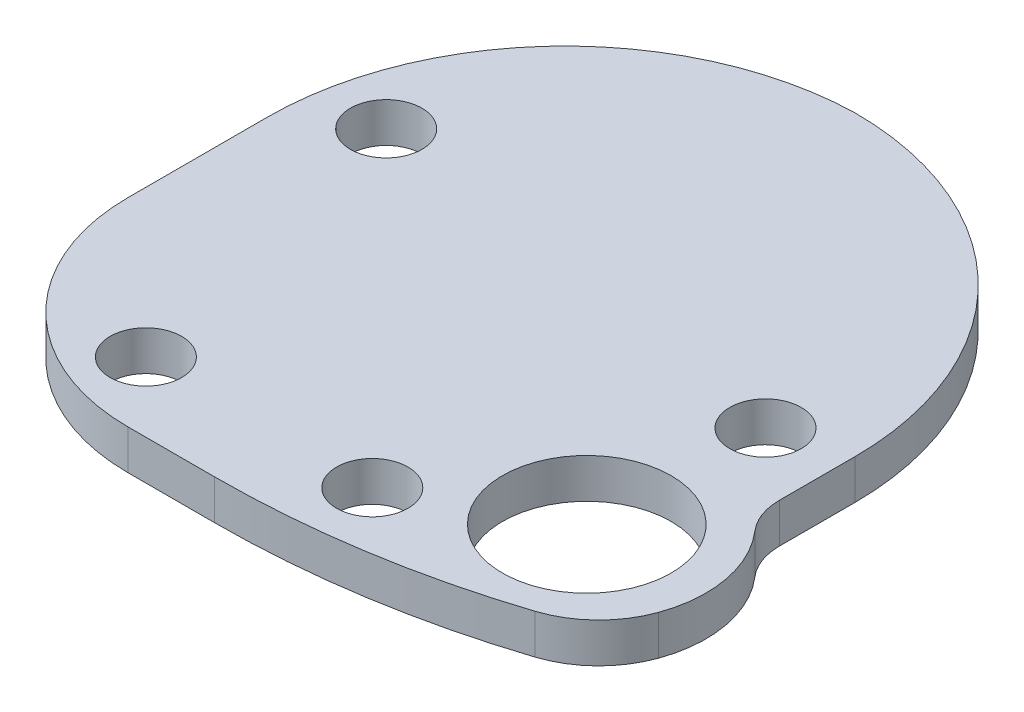
ISO-10303-21;
HEADER;
FILE_DESCRIPTION(('STEP AP214'),'2;1');
FILE_NAME('part.step','',(''),(''),'','','');
FILE_SCHEMA(('AUTOMOTIVE_DESIGN { 1 0 10303 214 1 1 1 1 }'));
ENDSEC;
DATA;
#1=APPLICATION_CONTEXT('core data for automotive mechanical design processes');
#2=APPLICATION_PROTOCOL_DEFINITION('international standard','automotive_design',2000,#1);
#3=PRODUCT_CONTEXT('',#1,'mechanical');
#4=PRODUCT('Part','Part','',(#3));
#5=PRODUCT_RELATED_PRODUCT_CATEGORY('part','',(#4));
#6=PRODUCT_DEFINITION_FORMATION('','',#4);
#7=PRODUCT_DEFINITION_CONTEXT('part definition',#1,'design');
#8=PRODUCT_DEFINITION('design','',#6,#7);
#9=PRODUCT_DEFINITION_SHAPE('','',#8);
#10=(LENGTH_UNIT() NAMED_UNIT(*) SI_UNIT(.MILLI.,.METRE.));
#11=(NAMED_UNIT(*) PLANE_ANGLE_UNIT() SI_UNIT($,.RADIAN.));
#12=(NAMED_UNIT(*) SI_UNIT($,.STERADIAN.) SOLID_ANGLE_UNIT());
#13=UNCERTAINTY_MEASURE_WITH_UNIT(LENGTH_MEASURE(1.E-05),#10,'distance_accuracy_value','');
#14=(GEOMETRIC_REPRESENTATION_CONTEXT(3) GLOBAL_UNCERTAINTY_ASSIGNED_CONTEXT((#13)) GLOBAL_UNIT_ASSIGNED_CONTEXT((#10,
#11,#12)) REPRESENTATION_CONTEXT('',''));
#15=CARTESIAN_POINT('',(0.,0.,0.));
#16=DIRECTION('',(0.,0.,1.));
#17=DIRECTION('',(1.,0.,0.));
#18=AXIS2_PLACEMENT_3D('',#15,#16,#17);
#19=CARTESIAN_POINT('',(48.3999999999403,3.,0.));
#20=DIRECTION('',(1.,0.,0.));
#21=DIRECTION('',(0.,0.,1.));
#22=AXIS2_PLACEMENT_3D('',#19,#20,#21);
#23=PLANE('',#22);
#24=DIRECTION('',(0.,0.,1.));
#25=VECTOR('',#24,1.);
#26=CARTESIAN_POINT('',(48.3999999999403,-14.8,100.3));
#27=LINE('',#26,#25);
#28=CARTESIAN_POINT('',(48.3999999999403,-14.8,100.3));
#29=VERTEX_POINT('',#28);
#30=CARTESIAN_POINT('',(48.3999999999403,-14.8,104.104238810875));
#31=VERTEX_POINT('',#30);
#32=EDGE_CURVE('E160',#29,#31,#27,.T.);
#33=ORIENTED_EDGE('',*,*,#32,.T.);
#34=DIRECTION('',(0.,-1.,0.));
#35=VECTOR('',#34,1.);
#36=CARTESIAN_POINT('',(48.3999999999403,3.,104.104238810875));
#37=LINE('',#36,#35);
#38=CARTESIAN_POINT('',(48.3999999999403,-16.8,104.104238810875));
#39=VERTEX_POINT('',#38);
#40=EDGE_CURVE('E43',#31,#39,#37,.T.);
#41=ORIENTED_EDGE('',*,*,#40,.T.);
#42=DIRECTION('',(0.,0.,1.));
#43=VECTOR('',#42,1.);
#44=CARTESIAN_POINT('',(48.3999999999403,-16.8,100.3));
#45=LINE('',#44,#43);
#46=CARTESIAN_POINT('',(48.3999999999403,-16.8,100.3));
#47=VERTEX_POINT('',#46);
#48=EDGE_CURVE('E157',#47,#39,#45,.T.);
#49=ORIENTED_EDGE('',*,*,#48,.F.);
#50=DIRECTION('',(0.,-1.,0.));
#51=VECTOR('',#50,1.);
#52=CARTESIAN_POINT('',(48.3999999999403,3.,100.3));
#53=LINE('',#52,#51);
#54=EDGE_CURVE('E149',#29,#47,#53,.T.);
#55=ORIENTED_EDGE('',*,*,#54,.F.);
#56=EDGE_LOOP('',(#33,#41,#49,#55));
#57=FACE_BOUND('',#56,.T.);
#58=ADVANCED_FACE('F35',(#57),#23,.T.);
#59=CARTESIAN_POINT('',(44.5999999998807,3.,110.));
#60=DIRECTION('',(0.,-1.,0.));
#61=DIRECTION('',(0.,0.,-1.));
#62=AXIS2_PLACEMENT_3D('',#59,#60,#61);
#63=CYLINDRICAL_SURFACE('',#62,6.);
#64=DIRECTION('',(0.,-1.,0.));
#65=VECTOR('',#64,1.);
#66=CARTESIAN_POINT('',(49.1333333332538,3.,106.069492540583));
#67=LINE('',#66,#65);
#68=CARTESIAN_POINT('',(49.1333333332538,-16.8,106.069492540583));
#69=VERTEX_POINT('',#68);
#70=CARTESIAN_POINT('',(49.1333333332538,-14.8,106.069492540583));
#71=VERTEX_POINT('',#70);
#72=EDGE_CURVE('E11',#69,#71,#67,.F.);
#73=ORIENTED_EDGE('',*,*,#72,.T.);
#74=CARTESIAN_POINT('',(44.5999999998807,-14.8,110.));
#75=DIRECTION('',(0.,-1.,0.));
#76=DIRECTION('',(0.,0.,-1.));
#77=AXIS2_PLACEMENT_3D('',#74,#75,#76);
#78=CIRCLE('',#77,6.);
#79=CARTESIAN_POINT('',(50.2472360342484,-14.8,112.026999055781));
#80=VERTEX_POINT('',#79);
#81=EDGE_CURVE('E50',#71,#80,#78,.T.);
#82=ORIENTED_EDGE('',*,*,#81,.T.);
#83=DIRECTION('',(0.,-1.,0.));
#84=VECTOR('',#83,1.);
#85=CARTESIAN_POINT('',(50.2472360342484,3.,112.026999055781));
#86=LINE('',#85,#84);
#87=CARTESIAN_POINT('',(50.2472360342484,-16.8,112.026999055781));
#88=VERTEX_POINT('',#87);
#89=EDGE_CURVE('E146',#88,#80,#86,.F.);
#90=ORIENTED_EDGE('',*,*,#89,.F.);
#91=CARTESIAN_POINT('',(44.5999999998807,-16.8,110.));
#92=DIRECTION('',(0.,-1.,0.));
#93=DIRECTION('',(0.,0.,-1.));
#94=AXIS2_PLACEMENT_3D('',#91,#92,#93);
#95=CIRCLE('',#94,6.);
#96=EDGE_CURVE('E168',#69,#88,#95,.T.);
#97=ORIENTED_EDGE('',*,*,#96,.F.);
#98=EDGE_LOOP('',(#73,#82,#90,#97));
#99=FACE_BOUND('',#98,.T.);
#100=ADVANCED_FACE('F247',(#99),#63,.T.);
#101=CARTESIAN_POINT('',(37.5999999998806,3.,117.3));
#102=DIRECTION('',(0.,0.,-1.));
#103=DIRECTION('',(1.,0.,0.));
#104=AXIS2_PLACEMENT_3D('',#101,#102,#103);
#105=PLANE('',#104);
#106=DIRECTION('',(0.,-1.,0.));
#107=VECTOR('',#106,1.);
#108=CARTESIAN_POINT('',(33.1669081557272,3.,117.3));
#109=LINE('',#108,#107);
#110=CARTESIAN_POINT('',(33.1669081557272,-14.8,117.3));
#111=VERTEX_POINT('',#110);
#112=CARTESIAN_POINT('',(33.1669081557272,-16.8,117.3));
#113=VERTEX_POINT('',#112);
#114=EDGE_CURVE('E142',#111,#113,#109,.T.);
#115=ORIENTED_EDGE('',*,*,#114,.F.);
#116=DIRECTION('',(-1.,0.,0.));
#117=VECTOR('',#116,1.);
#118=CARTESIAN_POINT('',(33.1669081557272,-14.8,117.3));
#119=LINE('',#118,#117);
#120=CARTESIAN_POINT('',(28.7999999999403,-14.8,117.3));
#121=VERTEX_POINT('',#120);
#122=EDGE_CURVE('E187',#111,#121,#119,.T.);
#123=ORIENTED_EDGE('',*,*,#122,.T.);
#124=DIRECTION('',(0.,-1.,0.));
#125=VECTOR('',#124,1.);
#126=CARTESIAN_POINT('',(28.7999999999403,3.,117.3));
#127=LINE('',#126,#125);
#128=CARTESIAN_POINT('',(28.7999999999403,-16.8,117.3));
#129=VERTEX_POINT('',#128);
#130=EDGE_CURVE('E117',#129,#121,#127,.F.);
#131=ORIENTED_EDGE('',*,*,#130,.F.);
#132=DIRECTION('',(-1.,0.,0.));
#133=VECTOR('',#132,1.);
#134=CARTESIAN_POINT('',(33.1669081557272,-16.8,117.3));
#135=LINE('',#134,#133);
#136=EDGE_CURVE('E126',#113,#129,#135,.T.);
#137=ORIENTED_EDGE('',*,*,#136,.F.);
#138=EDGE_LOOP('',(#115,#123,#131,#137));
#139=FACE_BOUND('',#138,.T.);
#140=ADVANCED_FACE('F183',(#139),#105,.F.);
#141=CARTESIAN_POINT('',(18.7999999999403,3.,0.));
#142=DIRECTION('',(-1.,0.,0.));
#143=DIRECTION('',(0.,0.,-1.));
#144=AXIS2_PLACEMENT_3D('',#141,#142,#143);
#145=PLANE('',#144);
#146=DIRECTION('',(0.,0.,-1.));
#147=VECTOR('',#146,1.);
#148=CARTESIAN_POINT('',(18.7999999999403,-14.8,107.3));
#149=LINE('',#148,#147);
#150=CARTESIAN_POINT('',(18.7999999999403,-14.8,107.3));
#151=VERTEX_POINT('',#150);
#152=CARTESIAN_POINT('',(18.7999999999403,-14.8,100.294665718181));
#153=VERTEX_POINT('',#152);
#154=EDGE_CURVE('E218',#151,#153,#149,.T.);
#155=ORIENTED_EDGE('',*,*,#154,.T.);
#156=DIRECTION('',(0.,1.,0.));
#157=VECTOR('',#156,1.);
#158=CARTESIAN_POINT('',(18.7999999999403,3.,100.294665718181));
#159=LINE('',#158,#157);
#160=CARTESIAN_POINT('',(18.7999999999403,-16.8,100.294665718181));
#161=VERTEX_POINT('',#160);
#162=EDGE_CURVE('E129',#161,#153,#159,.T.);
#163=ORIENTED_EDGE('',*,*,#162,.F.);
#164=DIRECTION('',(0.,0.,-1.));
#165=VECTOR('',#164,1.);
#166=CARTESIAN_POINT('',(18.7999999999403,-16.8,107.3));
#167=LINE('',#166,#165);
#168=CARTESIAN_POINT('',(18.7999999999403,-16.8,107.3));
#169=VERTEX_POINT('',#168);
#170=EDGE_CURVE('E123',#169,#161,#167,.T.);
#171=ORIENTED_EDGE('',*,*,#170,.F.);
#172=DIRECTION('',(0.,-1.,0.));
#173=VECTOR('',#172,1.);
#174=CARTESIAN_POINT('',(18.7999999999403,-10.5,107.3));
#175=LINE('',#174,#173);
#176=EDGE_CURVE('E108',#151,#169,#175,.T.);
#177=ORIENTED_EDGE('',*,*,#176,.F.);
#178=EDGE_LOOP('',(#155,#163,#171,#177));
#179=FACE_BOUND('',#178,.T.);
#180=ADVANCED_FACE('F128',(#179),#145,.T.);
#181=CARTESIAN_POINT('',(28.7999999999403,3.,107.3));
#182=DIRECTION('',(0.,1.,0.));
#183=DIRECTION('',(0.,0.,1.));
#184=AXIS2_PLACEMENT_3D('',#181,#182,#183);
#185=CYLINDRICAL_SURFACE('',#184,10.);
#186=CARTESIAN_POINT('',(28.7999999999403,-14.8,107.3));
#187=DIRECTION('',(0.,-1.,0.));
#188=DIRECTION('',(0.,0.,-1.));
#189=AXIS2_PLACEMENT_3D('',#186,#187,#188);
#190=CIRCLE('',#189,9.99999999999999);
#191=EDGE_CURVE('E114',#121,#151,#190,.T.);
#192=ORIENTED_EDGE('',*,*,#191,.T.);
#193=ORIENTED_EDGE('',*,*,#176,.T.);
#194=CARTESIAN_POINT('',(28.7999999999403,-16.8,107.3));
#195=DIRECTION('',(0.,-1.,0.));
#196=DIRECTION('',(0.,0.,-1.));
#197=AXIS2_PLACEMENT_3D('',#194,#195,#196);
#198=CIRCLE('',#197,10.);
#199=EDGE_CURVE('E112',#129,#169,#198,.T.);
#200=ORIENTED_EDGE('',*,*,#199,.F.);
#201=ORIENTED_EDGE('',*,*,#130,.T.);
#202=EDGE_LOOP('',(#192,#193,#200,#201));
#203=FACE_BOUND('',#202,.T.);
#204=ADVANCED_FACE('F110',(#203),#185,.T.);
#205=CARTESIAN_POINT('',(33.1669081557272,3.,72.3));
#206=DIRECTION('',(0.,-1.,0.));
#207=DIRECTION('',(0.,0.,-1.));
#208=AXIS2_PLACEMENT_3D('',#205,#206,#207);
#209=CYLINDRICAL_SURFACE('',#208,45.);
#210=CARTESIAN_POINT('',(33.1669081557272,-14.8,72.3));
#211=DIRECTION('',(0.,-1.,0.));
#212=DIRECTION('',(0.,0.,-1.));
#213=AXIS2_PLACEMENT_3D('',#210,#211,#212);
#214=CIRCLE('',#213,45.);
#215=CARTESIAN_POINT('',(47.0879932368438,-14.8,115.092562322959));
#216=VERTEX_POINT('',#215);
#217=EDGE_CURVE('E213',#216,#111,#214,.T.);
#218=ORIENTED_EDGE('',*,*,#217,.T.);
#219=ORIENTED_EDGE('',*,*,#114,.T.);
#220=CARTESIAN_POINT('',(33.1669081557272,-16.8,72.3));
#221=DIRECTION('',(0.,-1.,0.));
#222=DIRECTION('',(0.,0.,-1.));
#223=AXIS2_PLACEMENT_3D('',#220,#221,#222);
#224=CIRCLE('',#223,45.);
#225=CARTESIAN_POINT('',(47.0879932368438,-16.8,115.092562322959));
#226=VERTEX_POINT('',#225);
#227=EDGE_CURVE('E176',#226,#113,#224,.T.);
#228=ORIENTED_EDGE('',*,*,#227,.F.);
#229=DIRECTION('',(0.,-1.,0.));
#230=VECTOR('',#229,1.);
#231=CARTESIAN_POINT('',(47.0879932368438,3.,115.092562322959));
#232=LINE('',#231,#230);
#233=EDGE_CURVE('E144',#216,#226,#232,.T.);
#234=ORIENTED_EDGE('',*,*,#233,.F.);
#235=EDGE_LOOP('',(#218,#219,#228,#234));
#236=FACE_BOUND('',#235,.T.);
#237=ADVANCED_FACE('F258',(#236),#209,.T.);
#238=CARTESIAN_POINT('',(45.5412060056086,3.,110.337833175963));
#239=DIRECTION('',(0.,-1.,0.));
#240=DIRECTION('',(0.,0.,-1.));
#241=AXIS2_PLACEMENT_3D('',#238,#239,#240);
#242=CYLINDRICAL_SURFACE('',#241,5.);
#243=CARTESIAN_POINT('',(45.5412060056086,-14.8,110.337833175963));
#244=DIRECTION('',(0.,-1.,0.));
#245=DIRECTION('',(0.,0.,-1.));
#246=AXIS2_PLACEMENT_3D('',#243,#244,#245);
#247=CIRCLE('',#246,4.99999999999999);
#248=EDGE_CURVE('E210',#80,#216,#247,.T.);
#249=ORIENTED_EDGE('',*,*,#248,.T.);
#250=ORIENTED_EDGE('',*,*,#233,.T.);
#251=CARTESIAN_POINT('',(45.5412060056086,-16.8,110.337833175963));
#252=DIRECTION('',(0.,-1.,0.));
#253=DIRECTION('',(0.,0.,-1.));
#254=AXIS2_PLACEMENT_3D('',#251,#252,#253);
#255=CIRCLE('',#254,4.99999999999999);
#256=EDGE_CURVE('E170',#88,#226,#255,.T.);
#257=ORIENTED_EDGE('',*,*,#256,.F.);
#258=ORIENTED_EDGE('',*,*,#89,.T.);
#259=EDGE_LOOP('',(#249,#250,#257,#258));
#260=FACE_BOUND('',#259,.T.);
#261=ADVANCED_FACE('F261',(#260),#242,.T.);
#262=CARTESIAN_POINT('',(33.3999999999403,3.,100.3));
#263=DIRECTION('',(0.,-1.,0.));
#264=DIRECTION('',(0.,0.,-1.));
#265=AXIS2_PLACEMENT_3D('',#262,#263,#264);
#266=CYLINDRICAL_SURFACE('',#265,15.);
#267=CARTESIAN_POINT('',(33.3999999999403,-14.8,100.3));
#268=DIRECTION('',(0.,-1.,0.));
#269=DIRECTION('',(0.,0.,-1.));
#270=AXIS2_PLACEMENT_3D('',#267,#268,#269);
#271=CIRCLE('',#270,15.);
#272=CARTESIAN_POINT('',(33.3999999999403,-14.8,85.3));
#273=VERTEX_POINT('',#272);
#274=EDGE_CURVE('E135',#273,#29,#271,.T.);
#275=ORIENTED_EDGE('',*,*,#274,.T.);
#276=ORIENTED_EDGE('',*,*,#54,.T.);
#277=CARTESIAN_POINT('',(33.3999999999403,-16.8,100.3));
#278=DIRECTION('',(0.,-1.,0.));
#279=DIRECTION('',(0.,0.,-1.));
#280=AXIS2_PLACEMENT_3D('',#277,#278,#279);
#281=CIRCLE('',#280,15.);
#282=CARTESIAN_POINT('',(33.3999999999403,-16.8,85.3));
#283=VERTEX_POINT('',#282);
#284=EDGE_CURVE('E139',#283,#47,#281,.T.);
#285=ORIENTED_EDGE('',*,*,#284,.F.);
#286=DIRECTION('',(0.,1.,0.));
#287=VECTOR('',#286,1.);
#288=CARTESIAN_POINT('',(33.3999999999403,-16.8,85.3));
#289=LINE('',#288,#287);
#290=EDGE_CURVE('E118',#283,#273,#289,.T.);
#291=ORIENTED_EDGE('',*,*,#290,.T.);
#292=EDGE_LOOP('',(#275,#276,#285,#291));
#293=FACE_BOUND('',#292,.T.);
#294=ADVANCED_FACE('F198',(#293),#266,.T.);
#295=CARTESIAN_POINT('',(44.5999999998807,-9.5,110.));
#296=DIRECTION('',(0.,-1.,0.));
#297=DIRECTION('',(0.,0.,-1.));
#298=AXIS2_PLACEMENT_3D('',#295,#296,#297);
#299=CYLINDRICAL_SURFACE('',#298,4.25);
#300=CARTESIAN_POINT('',(44.5999999998807,-14.8,110.));
#301=DIRECTION('',(0.,-1.,0.));
#302=DIRECTION('',(0.,0.,-1.));
#303=AXIS2_PLACEMENT_3D('',#300,#301,#302);
#304=CIRCLE('',#303,4.25);
#305=CARTESIAN_POINT('',(44.5999999998807,-14.8,105.75));
#306=VERTEX_POINT('',#305);
#307=EDGE_CURVE('E220',#306,#306,#304,.T.);
#308=ORIENTED_EDGE('',*,*,#307,.F.);
#309=EDGE_LOOP('',(#308));
#310=FACE_BOUND('',#309,.T.);
#311=CARTESIAN_POINT('',(44.5999999998807,-16.8,110.));
#312=DIRECTION('',(0.,-1.,0.));
#313=DIRECTION('',(0.,0.,-1.));
#314=AXIS2_PLACEMENT_3D('',#311,#312,#313);
#315=CIRCLE('',#314,4.25);
#316=CARTESIAN_POINT('',(44.5999999998807,-16.8,105.75));
#317=VERTEX_POINT('',#316);
#318=EDGE_CURVE('E136',#317,#317,#315,.T.);
#319=ORIENTED_EDGE('',*,*,#318,.T.);
#320=EDGE_LOOP('',(#319));
#321=FACE_BOUND('',#320,.T.);
#322=ADVANCED_FACE('F227',(#310,#321),#299,.F.);
#323=CARTESIAN_POINT('',(33.7999999999403,3.,100.294665718181));
#324=DIRECTION('',(0.,-1.,0.));
#325=DIRECTION('',(0.,0.,-1.));
#326=AXIS2_PLACEMENT_3D('',#323,#324,#325);
#327=CYLINDRICAL_SURFACE('',#326,15.);
#328=ORIENTED_EDGE('',*,*,#162,.T.);
#329=CARTESIAN_POINT('',(33.7999999999403,-14.8,100.294665718181));
#330=DIRECTION('',(0.,-1.,0.));
#331=DIRECTION('',(0.,0.,-1.));
#332=AXIS2_PLACEMENT_3D('',#329,#330,#331);
#333=CIRCLE('',#332,15.);
#334=EDGE_CURVE('E73',#153,#273,#333,.T.);
#335=ORIENTED_EDGE('',*,*,#334,.T.);
#336=ORIENTED_EDGE('',*,*,#290,.F.);
#337=CARTESIAN_POINT('',(33.7999999999403,-16.8,100.294665718181));
#338=DIRECTION('',(0.,-1.,0.));
#339=DIRECTION('',(0.,0.,-1.));
#340=AXIS2_PLACEMENT_3D('',#337,#338,#339);
#341=CIRCLE('',#340,15.);
#342=EDGE_CURVE('E59',#161,#283,#341,.T.);
#343=ORIENTED_EDGE('',*,*,#342,.F.);
#344=EDGE_LOOP('',(#328,#335,#336,#343));
#345=FACE_BOUND('',#344,.T.);
#346=ADVANCED_FACE('F230',(#345),#327,.T.);
#347=CARTESIAN_POINT('',(51.3999999999403,3.,104.104238810875));
#348=DIRECTION('',(0.,-1.,0.));
#349=DIRECTION('',(0.,0.,-1.));
#350=AXIS2_PLACEMENT_3D('',#347,#348,#349);
#351=CYLINDRICAL_SURFACE('',#350,3.);
#352=ORIENTED_EDGE('',*,*,#40,.F.);
#353=CARTESIAN_POINT('',(51.3999999999403,-14.8,104.104238810875));
#354=DIRECTION('',(0.,1.,0.));
#355=DIRECTION('',(0.,0.,-1.));
#356=AXIS2_PLACEMENT_3D('',#353,#354,#355);
#357=CIRCLE('',#356,3.);
#358=EDGE_CURVE('E200',#31,#71,#357,.T.);
#359=ORIENTED_EDGE('',*,*,#358,.T.);
#360=ORIENTED_EDGE('',*,*,#72,.F.);
#361=CARTESIAN_POINT('',(51.3999999999403,-16.8,104.104238810875));
#362=DIRECTION('',(0.,1.,0.));
#363=DIRECTION('',(0.,0.,-1.));
#364=AXIS2_PLACEMENT_3D('',#361,#362,#363);
#365=CIRCLE('',#364,3.);
#366=EDGE_CURVE('E165',#39,#69,#365,.T.);
#367=ORIENTED_EDGE('',*,*,#366,.F.);
#368=EDGE_LOOP('',(#352,#359,#360,#367));
#369=FACE_BOUND('',#368,.T.);
#370=ADVANCED_FACE('F37',(#369),#351,.F.);
#371=CARTESIAN_POINT('',(33.3999999999403,-16.8,100.3));
#372=DIRECTION('',(0.,-1.,0.));
#373=DIRECTION('',(0.,0.,-1.));
#374=AXIS2_PLACEMENT_3D('',#371,#372,#373);
#375=PLANE('',#374);
#376=CARTESIAN_POINT('',(26.1999999999403,-16.8,113.8));
#377=DIRECTION('',(0.,1.,0.));
#378=DIRECTION('',(0.,0.,1.));
#379=AXIS2_PLACEMENT_3D('',#376,#377,#378);
#380=CIRCLE('',#379,1.8);
#381=CARTESIAN_POINT('',(26.1999999999403,-16.8,115.6));
#382=VERTEX_POINT('',#381);
#383=EDGE_CURVE('E331',#382,#382,#380,.T.);
#384=ORIENTED_EDGE('',*,*,#383,.T.);
#385=EDGE_LOOP('',(#384));
#386=FACE_BOUND('',#385,.T.);
#387=CARTESIAN_POINT('',(22.2999999999403,-16.8,97.8000000000001));
#388=DIRECTION('',(0.,1.,0.));
#389=DIRECTION('',(0.,0.,1.));
#390=AXIS2_PLACEMENT_3D('',#387,#388,#389);
#391=CIRCLE('',#390,1.8);
#392=CARTESIAN_POINT('',(22.2999999999403,-16.8,99.6000000000001));
#393=VERTEX_POINT('',#392);
#394=EDGE_CURVE('E335',#393,#393,#391,.T.);
#395=ORIENTED_EDGE('',*,*,#394,.T.);
#396=EDGE_LOOP('',(#395));
#397=FACE_BOUND('',#396,.T.);
#398=CARTESIAN_POINT('',(44.8999999999403,-16.8,101.3));
#399=DIRECTION('',(0.,1.,0.));
#400=DIRECTION('',(0.,0.,1.));
#401=AXIS2_PLACEMENT_3D('',#398,#399,#400);
#402=CIRCLE('',#401,1.8);
#403=CARTESIAN_POINT('',(44.8999999999403,-16.8,103.1));
#404=VERTEX_POINT('',#403);
#405=EDGE_CURVE('E344',#404,#404,#402,.T.);
#406=ORIENTED_EDGE('',*,*,#405,.T.);
#407=EDGE_LOOP('',(#406));
#408=FACE_BOUND('',#407,.T.);
#409=CARTESIAN_POINT('',(37.5999999998806,-16.8,113.8));
#410=DIRECTION('',(0.,1.,0.));
#411=DIRECTION('',(0.,0.,1.));
#412=AXIS2_PLACEMENT_3D('',#409,#410,#411);
#413=CIRCLE('',#412,1.8);
#414=CARTESIAN_POINT('',(37.5999999998806,-16.8,115.6));
#415=VERTEX_POINT('',#414);
#416=EDGE_CURVE('E201',#415,#415,#413,.T.);
#417=ORIENTED_EDGE('',*,*,#416,.T.);
#418=EDGE_LOOP('',(#417));
#419=FACE_BOUND('',#418,.T.);
#420=ORIENTED_EDGE('',*,*,#284,.T.);
#421=ORIENTED_EDGE('',*,*,#48,.T.);
#422=ORIENTED_EDGE('',*,*,#366,.T.);
#423=ORIENTED_EDGE('',*,*,#96,.T.);
#424=ORIENTED_EDGE('',*,*,#256,.T.);
#425=ORIENTED_EDGE('',*,*,#227,.T.);
#426=ORIENTED_EDGE('',*,*,#136,.T.);
#427=ORIENTED_EDGE('',*,*,#199,.T.);
#428=ORIENTED_EDGE('',*,*,#170,.T.);
#429=ORIENTED_EDGE('',*,*,#342,.T.);
#430=EDGE_LOOP('',(#420,#421,#422,#423,#424,#425,#426,#427,#428,#429));
#431=FACE_BOUND('',#430,.T.);
#432=ORIENTED_EDGE('',*,*,#318,.F.);
#433=EDGE_LOOP('',(#432));
#434=FACE_BOUND('',#433,.T.);
#435=ADVANCED_FACE('F121',(#386,#397,#408,#419,#431,#434),#375,.T.);
#436=CARTESIAN_POINT('',(33.3999999999403,-14.8,100.3));
#437=DIRECTION('',(0.,-1.,0.));
#438=DIRECTION('',(0.,0.,-1.));
#439=AXIS2_PLACEMENT_3D('',#436,#437,#438);
#440=PLANE('',#439);
#441=CARTESIAN_POINT('',(26.1999999999403,-14.8,113.8));
#442=DIRECTION('',(0.,1.,0.));
#443=DIRECTION('',(0.,0.,1.));
#444=AXIS2_PLACEMENT_3D('',#441,#442,#443);
#445=CIRCLE('',#444,1.8);
#446=CARTESIAN_POINT('',(26.1999999999403,-14.8,115.6));
#447=VERTEX_POINT('',#446);
#448=EDGE_CURVE('E334',#447,#447,#445,.T.);
#449=ORIENTED_EDGE('',*,*,#448,.F.);
#450=EDGE_LOOP('',(#449));
#451=FACE_BOUND('',#450,.T.);
#452=CARTESIAN_POINT('',(22.2999999999403,-14.8,97.8000000000001));
#453=DIRECTION('',(0.,1.,0.));
#454=DIRECTION('',(0.,0.,1.));
#455=AXIS2_PLACEMENT_3D('',#452,#453,#454);
#456=CIRCLE('',#455,1.8);
#457=CARTESIAN_POINT('',(22.2999999999403,-14.8,99.6000000000001));
#458=VERTEX_POINT('',#457);
#459=EDGE_CURVE('E339',#458,#458,#456,.T.);
#460=ORIENTED_EDGE('',*,*,#459,.F.);
#461=EDGE_LOOP('',(#460));
#462=FACE_BOUND('',#461,.T.);
#463=CARTESIAN_POINT('',(44.8999999999403,-14.8,101.3));
#464=DIRECTION('',(0.,1.,0.));
#465=DIRECTION('',(0.,0.,1.));
#466=AXIS2_PLACEMENT_3D('',#463,#464,#465);
#467=CIRCLE('',#466,1.8);
#468=CARTESIAN_POINT('',(44.8999999999403,-14.8,103.1));
#469=VERTEX_POINT('',#468);
#470=EDGE_CURVE('E347',#469,#469,#467,.T.);
#471=ORIENTED_EDGE('',*,*,#470,.F.);
#472=EDGE_LOOP('',(#471));
#473=FACE_BOUND('',#472,.T.);
#474=CARTESIAN_POINT('',(37.5999999998806,-14.8,113.8));
#475=DIRECTION('',(0.,1.,0.));
#476=DIRECTION('',(0.,0.,1.));
#477=AXIS2_PLACEMENT_3D('',#474,#475,#476);
#478=CIRCLE('',#477,1.8);
#479=CARTESIAN_POINT('',(37.5999999998806,-14.8,115.6));
#480=VERTEX_POINT('',#479);
#481=EDGE_CURVE('E205',#480,#480,#478,.T.);
#482=ORIENTED_EDGE('',*,*,#481,.F.);
#483=EDGE_LOOP('',(#482));
#484=FACE_BOUND('',#483,.T.);
#485=ORIENTED_EDGE('',*,*,#307,.T.);
#486=EDGE_LOOP('',(#485));
#487=FACE_BOUND('',#486,.T.);
#488=ORIENTED_EDGE('',*,*,#334,.F.);
#489=ORIENTED_EDGE('',*,*,#154,.F.);
#490=ORIENTED_EDGE('',*,*,#191,.F.);
#491=ORIENTED_EDGE('',*,*,#122,.F.);
#492=ORIENTED_EDGE('',*,*,#217,.F.);
#493=ORIENTED_EDGE('',*,*,#248,.F.);
#494=ORIENTED_EDGE('',*,*,#81,.F.);
#495=ORIENTED_EDGE('',*,*,#358,.F.);
#496=ORIENTED_EDGE('',*,*,#32,.F.);
#497=ORIENTED_EDGE('',*,*,#274,.F.);
#498=EDGE_LOOP('',(#488,#489,#490,#491,#492,#493,#494,#495,#496,#497));
#499=FACE_BOUND('',#498,.T.);
#500=ADVANCED_FACE('F199',(#451,#462,#473,#484,#487,#499),#440,.F.);
#501=CARTESIAN_POINT('',(37.5999999998806,-16.8,113.8));
#502=DIRECTION('',(0.,1.,0.));
#503=DIRECTION('',(0.,0.,1.));
#504=AXIS2_PLACEMENT_3D('',#501,#502,#503);
#505=CYLINDRICAL_SURFACE('',#504,1.8);
#506=ORIENTED_EDGE('',*,*,#416,.F.);
#507=EDGE_LOOP('',(#506));
#508=FACE_BOUND('',#507,.T.);
#509=ORIENTED_EDGE('',*,*,#481,.T.);
#510=EDGE_LOOP('',(#509));
#511=FACE_BOUND('',#510,.T.);
#512=ADVANCED_FACE('F240',(#508,#511),#505,.F.);
#513=CARTESIAN_POINT('',(44.8999999999403,-16.8,101.3));
#514=DIRECTION('',(0.,1.,0.));
#515=DIRECTION('',(0.,0.,1.));
#516=AXIS2_PLACEMENT_3D('',#513,#514,#515);
#517=CYLINDRICAL_SURFACE('',#516,1.8);
#518=ORIENTED_EDGE('',*,*,#405,.F.);
#519=EDGE_LOOP('',(#518));
#520=FACE_BOUND('',#519,.T.);
#521=ORIENTED_EDGE('',*,*,#470,.T.);
#522=EDGE_LOOP('',(#521));
#523=FACE_BOUND('',#522,.T.);
#524=ADVANCED_FACE('F296',(#520,#523),#517,.F.);
#525=CARTESIAN_POINT('',(22.2999999999403,-16.8,97.8000000000001));
#526=DIRECTION('',(0.,1.,0.));
#527=DIRECTION('',(0.,0.,1.));
#528=AXIS2_PLACEMENT_3D('',#525,#526,#527);
#529=CYLINDRICAL_SURFACE('',#528,1.8);
#530=ORIENTED_EDGE('',*,*,#394,.F.);
#531=EDGE_LOOP('',(#530));
#532=FACE_BOUND('',#531,.T.);
#533=ORIENTED_EDGE('',*,*,#459,.T.);
#534=EDGE_LOOP('',(#533));
#535=FACE_BOUND('',#534,.T.);
#536=ADVANCED_FACE('F305',(#532,#535),#529,.F.);
#537=CARTESIAN_POINT('',(26.1999999999403,-16.8,113.8));
#538=DIRECTION('',(0.,1.,0.));
#539=DIRECTION('',(0.,0.,1.));
#540=AXIS2_PLACEMENT_3D('',#537,#538,#539);
#541=CYLINDRICAL_SURFACE('',#540,1.8);
#542=ORIENTED_EDGE('',*,*,#383,.F.);
#543=EDGE_LOOP('',(#542));
#544=FACE_BOUND('',#543,.T.);
#545=ORIENTED_EDGE('',*,*,#448,.T.);
#546=EDGE_LOOP('',(#545));
#547=FACE_BOUND('',#546,.T.);
#548=ADVANCED_FACE('F315',(#544,#547),#541,.F.);
#549=CLOSED_SHELL('',(#58,#100,#140,#180,#204,#237,#261,#294,#322,#346,#370,#435,#500,#512,#524,
#536,#548));
#550=MANIFOLD_SOLID_BREP('B2',#549);
#551=ADVANCED_BREP_SHAPE_REPRESENTATION('',(#18,#550),#14);
#552=SHAPE_DEFINITION_REPRESENTATION(#9,#551);
ENDSEC;
END-ISO-10303-21;
